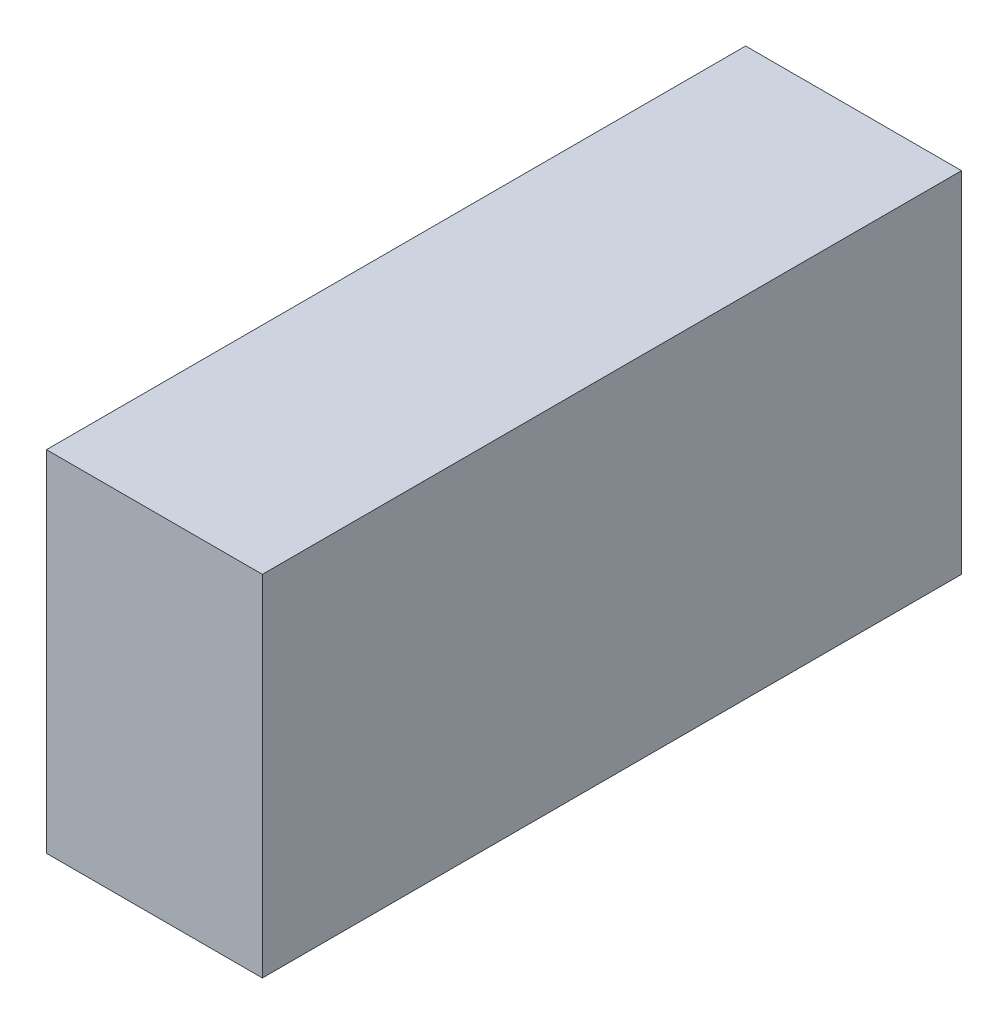
ISO-10303-21;
HEADER;
FILE_DESCRIPTION(('STEP AP214'),'2;1');
FILE_NAME('part.step','',(''),(''),'','','');
FILE_SCHEMA(('AUTOMOTIVE_DESIGN { 1 0 10303 214 1 1 1 1 }'));
ENDSEC;
DATA;
#1=APPLICATION_CONTEXT('core data for automotive mechanical design processes');
#2=APPLICATION_PROTOCOL_DEFINITION('international standard','automotive_design',2000,#1);
#3=PRODUCT_CONTEXT('',#1,'mechanical');
#4=PRODUCT('Part','Part','',(#3));
#5=PRODUCT_RELATED_PRODUCT_CATEGORY('part','',(#4));
#6=PRODUCT_DEFINITION_FORMATION('','',#4);
#7=PRODUCT_DEFINITION_CONTEXT('part definition',#1,'design');
#8=PRODUCT_DEFINITION('design','',#6,#7);
#9=PRODUCT_DEFINITION_SHAPE('','',#8);
#10=(LENGTH_UNIT() NAMED_UNIT(*) SI_UNIT(.MILLI.,.METRE.));
#11=(NAMED_UNIT(*) PLANE_ANGLE_UNIT() SI_UNIT($,.RADIAN.));
#12=(NAMED_UNIT(*) SI_UNIT($,.STERADIAN.) SOLID_ANGLE_UNIT());
#13=UNCERTAINTY_MEASURE_WITH_UNIT(LENGTH_MEASURE(1.E-05),#10,'distance_accuracy_value','');
#14=(GEOMETRIC_REPRESENTATION_CONTEXT(3) GLOBAL_UNCERTAINTY_ASSIGNED_CONTEXT((#13)) GLOBAL_UNIT_ASSIGNED_CONTEXT((#10,
#11,#12)) REPRESENTATION_CONTEXT('',''));
#15=CARTESIAN_POINT('',(0.,0.,0.));
#16=DIRECTION('',(0.,0.,1.));
#17=DIRECTION('',(1.,0.,0.));
#18=AXIS2_PLACEMENT_3D('',#15,#16,#17);
#19=CARTESIAN_POINT('',(42.,68.,0.));
#20=DIRECTION('',(0.,0.,-1.));
#21=DIRECTION('',(-1.,0.,0.));
#22=AXIS2_PLACEMENT_3D('',#19,#20,#21);
#23=PLANE('',#22);
#24=DIRECTION('',(1.,0.,0.));
#25=VECTOR('',#24,1.);
#26=CARTESIAN_POINT('',(42.,0.,0.));
#27=LINE('',#26,#25);
#28=CARTESIAN_POINT('',(0.,0.,0.));
#29=VERTEX_POINT('',#28);
#30=CARTESIAN_POINT('',(42.,0.,0.));
#31=VERTEX_POINT('',#30);
#32=EDGE_CURVE('E99',#29,#31,#27,.T.);
#33=ORIENTED_EDGE('',*,*,#32,.T.);
#34=DIRECTION('',(0.,-1.,0.));
#35=VECTOR('',#34,1.);
#36=CARTESIAN_POINT('',(42.,68.,0.));
#37=LINE('',#36,#35);
#38=CARTESIAN_POINT('',(42.,68.,0.));
#39=VERTEX_POINT('',#38);
#40=EDGE_CURVE('E11',#39,#31,#37,.T.);
#41=ORIENTED_EDGE('',*,*,#40,.F.);
#42=DIRECTION('',(1.,0.,0.));
#43=VECTOR('',#42,1.);
#44=CARTESIAN_POINT('',(42.,68.,0.));
#45=LINE('',#44,#43);
#46=CARTESIAN_POINT('',(0.,68.,0.));
#47=VERTEX_POINT('',#46);
#48=EDGE_CURVE('E87',#47,#39,#45,.T.);
#49=ORIENTED_EDGE('',*,*,#48,.F.);
#50=DIRECTION('',(0.,-1.,0.));
#51=VECTOR('',#50,1.);
#52=CARTESIAN_POINT('',(0.,68.,0.));
#53=LINE('',#52,#51);
#54=EDGE_CURVE('E95',#47,#29,#53,.T.);
#55=ORIENTED_EDGE('',*,*,#54,.T.);
#56=EDGE_LOOP('',(#33,#41,#49,#55));
#57=FACE_BOUND('',#56,.T.);
#58=ADVANCED_FACE('F36',(#57),#23,.F.);
#59=CARTESIAN_POINT('',(42.,68.,-136.));
#60=DIRECTION('',(-1.,0.,0.));
#61=DIRECTION('',(0.,0.,1.));
#62=AXIS2_PLACEMENT_3D('',#59,#60,#61);
#63=PLANE('',#62);
#64=DIRECTION('',(0.,0.,-1.));
#65=VECTOR('',#64,1.);
#66=CARTESIAN_POINT('',(42.,0.,-136.));
#67=LINE('',#66,#65);
#68=CARTESIAN_POINT('',(42.,0.,-136.));
#69=VERTEX_POINT('',#68);
#70=EDGE_CURVE('E91',#31,#69,#67,.T.);
#71=ORIENTED_EDGE('',*,*,#70,.T.);
#72=DIRECTION('',(0.,-1.,0.));
#73=VECTOR('',#72,1.);
#74=CARTESIAN_POINT('',(42.,68.,-136.));
#75=LINE('',#74,#73);
#76=CARTESIAN_POINT('',(42.,68.,-136.));
#77=VERTEX_POINT('',#76);
#78=EDGE_CURVE('E44',#77,#69,#75,.T.);
#79=ORIENTED_EDGE('',*,*,#78,.F.);
#80=DIRECTION('',(0.,0.,-1.));
#81=VECTOR('',#80,1.);
#82=CARTESIAN_POINT('',(42.,68.,-136.));
#83=LINE('',#82,#81);
#84=EDGE_CURVE('E82',#39,#77,#83,.T.);
#85=ORIENTED_EDGE('',*,*,#84,.F.);
#86=ORIENTED_EDGE('',*,*,#40,.T.);
#87=EDGE_LOOP('',(#71,#79,#85,#86));
#88=FACE_BOUND('',#87,.T.);
#89=ADVANCED_FACE('F90',(#88),#63,.F.);
#90=CARTESIAN_POINT('',(0.,68.,-136.));
#91=DIRECTION('',(0.,0.,1.));
#92=DIRECTION('',(1.,0.,0.));
#93=AXIS2_PLACEMENT_3D('',#90,#91,#92);
#94=PLANE('',#93);
#95=DIRECTION('',(-1.,0.,0.));
#96=VECTOR('',#95,1.);
#97=CARTESIAN_POINT('',(0.,0.,-136.));
#98=LINE('',#97,#96);
#99=CARTESIAN_POINT('',(0.,0.,-136.));
#100=VERTEX_POINT('',#99);
#101=EDGE_CURVE('E69',#69,#100,#98,.T.);
#102=ORIENTED_EDGE('',*,*,#101,.T.);
#103=DIRECTION('',(0.,-1.,0.));
#104=VECTOR('',#103,1.);
#105=CARTESIAN_POINT('',(0.,68.,-136.));
#106=LINE('',#105,#104);
#107=CARTESIAN_POINT('',(0.,68.,-136.));
#108=VERTEX_POINT('',#107);
#109=EDGE_CURVE('E92',#108,#100,#106,.T.);
#110=ORIENTED_EDGE('',*,*,#109,.F.);
#111=DIRECTION('',(-1.,0.,0.));
#112=VECTOR('',#111,1.);
#113=CARTESIAN_POINT('',(0.,68.,-136.));
#114=LINE('',#113,#112);
#115=EDGE_CURVE('E85',#77,#108,#114,.T.);
#116=ORIENTED_EDGE('',*,*,#115,.F.);
#117=ORIENTED_EDGE('',*,*,#78,.T.);
#118=EDGE_LOOP('',(#102,#110,#116,#117));
#119=FACE_BOUND('',#118,.T.);
#120=ADVANCED_FACE('F93',(#119),#94,.F.);
#121=CARTESIAN_POINT('',(0.,68.,0.));
#122=DIRECTION('',(1.,0.,0.));
#123=DIRECTION('',(0.,0.,-1.));
#124=AXIS2_PLACEMENT_3D('',#121,#122,#123);
#125=PLANE('',#124);
#126=DIRECTION('',(0.,0.,1.));
#127=VECTOR('',#126,1.);
#128=CARTESIAN_POINT('',(0.,0.,0.));
#129=LINE('',#128,#127);
#130=EDGE_CURVE('E75',#100,#29,#129,.T.);
#131=ORIENTED_EDGE('',*,*,#130,.T.);
#132=ORIENTED_EDGE('',*,*,#54,.F.);
#133=DIRECTION('',(0.,0.,1.));
#134=VECTOR('',#133,1.);
#135=CARTESIAN_POINT('',(0.,68.,0.));
#136=LINE('',#135,#134);
#137=EDGE_CURVE('E52',#108,#47,#136,.T.);
#138=ORIENTED_EDGE('',*,*,#137,.F.);
#139=ORIENTED_EDGE('',*,*,#109,.T.);
#140=EDGE_LOOP('',(#131,#132,#138,#139));
#141=FACE_BOUND('',#140,.T.);
#142=ADVANCED_FACE('F106',(#141),#125,.F.);
#143=CARTESIAN_POINT('',(0.,68.,0.));
#144=DIRECTION('',(0.,-1.,0.));
#145=DIRECTION('',(0.,0.,-1.));
#146=AXIS2_PLACEMENT_3D('',#143,#144,#145);
#147=PLANE('',#146);
#148=ORIENTED_EDGE('',*,*,#48,.T.);
#149=ORIENTED_EDGE('',*,*,#84,.T.);
#150=ORIENTED_EDGE('',*,*,#115,.T.);
#151=ORIENTED_EDGE('',*,*,#137,.T.);
#152=EDGE_LOOP('',(#148,#149,#150,#151));
#153=FACE_BOUND('',#152,.T.);
#154=ADVANCED_FACE('F83',(#153),#147,.F.);
#155=CARTESIAN_POINT('',(0.,0.,0.));
#156=DIRECTION('',(0.,-1.,0.));
#157=DIRECTION('',(0.,0.,-1.));
#158=AXIS2_PLACEMENT_3D('',#155,#156,#157);
#159=PLANE('',#158);
#160=ORIENTED_EDGE('',*,*,#32,.F.);
#161=ORIENTED_EDGE('',*,*,#130,.F.);
#162=ORIENTED_EDGE('',*,*,#101,.F.);
#163=ORIENTED_EDGE('',*,*,#70,.F.);
#164=EDGE_LOOP('',(#160,#161,#162,#163));
#165=FACE_BOUND('',#164,.T.);
#166=ADVANCED_FACE('F109',(#165),#159,.T.);
#167=CLOSED_SHELL('',(#58,#89,#120,#142,#154,#166));
#168=MANIFOLD_SOLID_BREP('B2',#167);
#169=ADVANCED_BREP_SHAPE_REPRESENTATION('',(#18,#168),#14);
#170=SHAPE_DEFINITION_REPRESENTATION(#9,#169);
ENDSEC;
END-ISO-10303-21;
